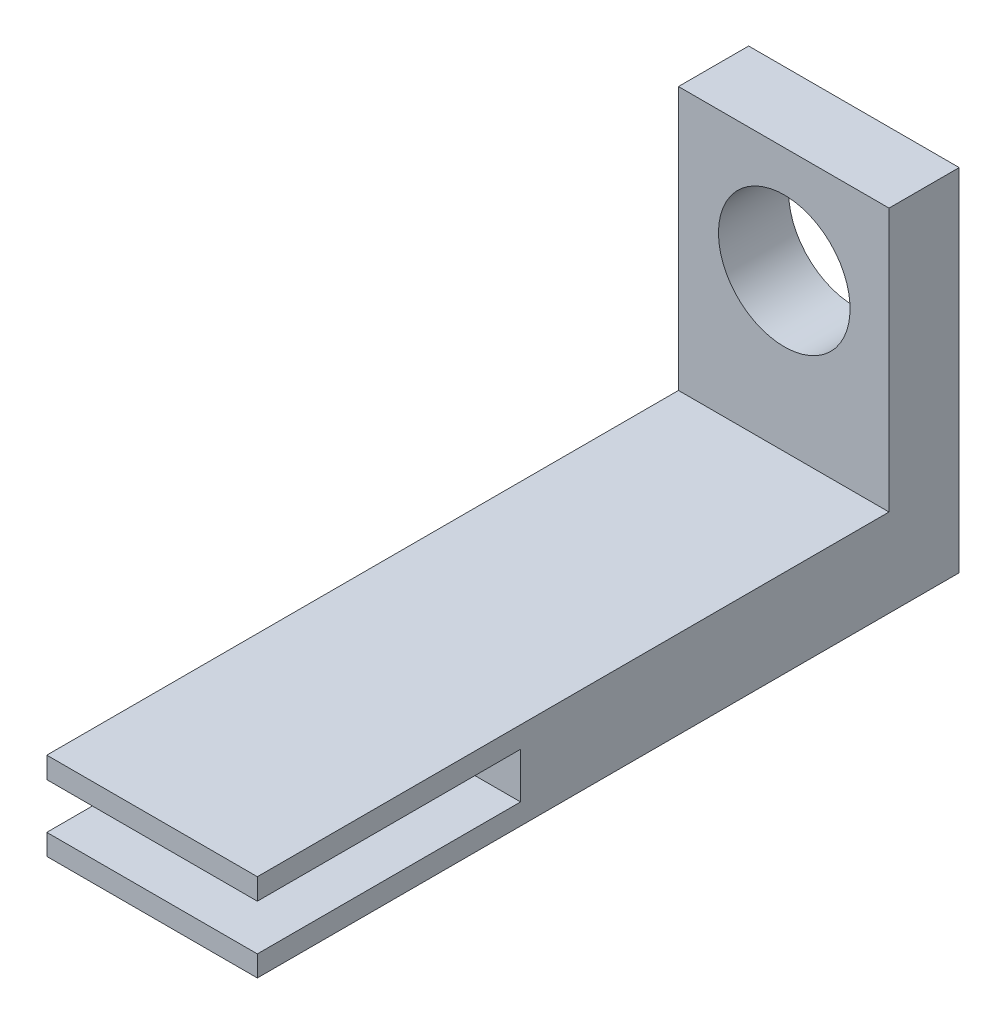
ISO-10303-21;
HEADER;
FILE_DESCRIPTION(('STEP AP214'),'2;1');
FILE_NAME('part.step','',(''),(''),'','','');
FILE_SCHEMA(('AUTOMOTIVE_DESIGN { 1 0 10303 214 1 1 1 1 }'));
ENDSEC;
DATA;
#1=APPLICATION_CONTEXT('core data for automotive mechanical design processes');
#2=APPLICATION_PROTOCOL_DEFINITION('international standard','automotive_design',2000,#1);
#3=PRODUCT_CONTEXT('',#1,'mechanical');
#4=PRODUCT('Part','Part','',(#3));
#5=PRODUCT_RELATED_PRODUCT_CATEGORY('part','',(#4));
#6=PRODUCT_DEFINITION_FORMATION('','',#4);
#7=PRODUCT_DEFINITION_CONTEXT('part definition',#1,'design');
#8=PRODUCT_DEFINITION('design','',#6,#7);
#9=PRODUCT_DEFINITION_SHAPE('','',#8);
#10=(LENGTH_UNIT() NAMED_UNIT(*) SI_UNIT(.MILLI.,.METRE.));
#11=(NAMED_UNIT(*) PLANE_ANGLE_UNIT() SI_UNIT($,.RADIAN.));
#12=(NAMED_UNIT(*) SI_UNIT($,.STERADIAN.) SOLID_ANGLE_UNIT());
#13=UNCERTAINTY_MEASURE_WITH_UNIT(LENGTH_MEASURE(1.E-05),#10,'distance_accuracy_value','');
#14=(GEOMETRIC_REPRESENTATION_CONTEXT(3) GLOBAL_UNCERTAINTY_ASSIGNED_CONTEXT((#13)) GLOBAL_UNIT_ASSIGNED_CONTEXT((#10,
#11,#12)) REPRESENTATION_CONTEXT('',''));
#15=CARTESIAN_POINT('',(0.,0.,0.));
#16=DIRECTION('',(0.,0.,1.));
#17=DIRECTION('',(1.,0.,0.));
#18=AXIS2_PLACEMENT_3D('',#15,#16,#17);
#19=CARTESIAN_POINT('',(-15.7647058823529,5.,-3.05882352941177));
#20=DIRECTION('',(0.,0.,-1.));
#21=DIRECTION('',(-1.,0.,0.));
#22=AXIS2_PLACEMENT_3D('',#19,#20,#21);
#23=PLANE('',#22);
#24=DIRECTION('',(0.,-1.,0.));
#25=VECTOR('',#24,1.);
#26=CARTESIAN_POINT('',(-3.76470588235294,5.,-3.05882352941177));
#27=LINE('',#26,#25);
#28=CARTESIAN_POINT('',(-3.76470588235294,1.18956511839395,-3.05882352941177));
#29=VERTEX_POINT('',#28);
#30=CARTESIAN_POINT('',(-3.76470588235294,0.,-3.05882352941177));
#31=VERTEX_POINT('',#30);
#32=EDGE_CURVE('E171',#29,#31,#27,.T.);
#33=ORIENTED_EDGE('',*,*,#32,.F.);
#34=DIRECTION('',(-1.,0.,0.));
#35=VECTOR('',#34,1.);
#36=CARTESIAN_POINT('',(-15.7647058823529,1.18956511839395,-3.05882352941177));
#37=LINE('',#36,#35);
#38=CARTESIAN_POINT('',(-15.7647058823529,1.18956511839395,-3.05882352941177));
#39=VERTEX_POINT('',#38);
#40=EDGE_CURVE('E46',#29,#39,#37,.T.);
#41=ORIENTED_EDGE('',*,*,#40,.T.);
#42=DIRECTION('',(0.,-1.,0.));
#43=VECTOR('',#42,1.);
#44=CARTESIAN_POINT('',(-15.7647058823529,5.,-3.05882352941177));
#45=LINE('',#44,#43);
#46=CARTESIAN_POINT('',(-15.7647058823529,0.,-3.05882352941177));
#47=VERTEX_POINT('',#46);
#48=EDGE_CURVE('E184',#39,#47,#45,.T.);
#49=ORIENTED_EDGE('',*,*,#48,.T.);
#50=DIRECTION('',(1.,0.,0.));
#51=VECTOR('',#50,1.);
#52=CARTESIAN_POINT('',(-15.7647058823529,0.,-3.05882352941177));
#53=LINE('',#52,#51);
#54=EDGE_CURVE('E167',#47,#31,#53,.T.);
#55=ORIENTED_EDGE('',*,*,#54,.T.);
#56=EDGE_LOOP('',(#33,#41,#49,#55));
#57=FACE_BOUND('',#56,.T.);
#58=ADVANCED_FACE('F37',(#57),#23,.F.);
#59=CARTESIAN_POINT('',(-3.76470588235294,5.,-43.0588235294118));
#60=DIRECTION('',(-1.,0.,0.));
#61=DIRECTION('',(0.,0.,1.));
#62=AXIS2_PLACEMENT_3D('',#59,#60,#61);
#63=PLANE('',#62);
#64=DIRECTION('',(0.,1.,0.));
#65=VECTOR('',#64,1.);
#66=CARTESIAN_POINT('',(-3.76470588235294,1.18956511839395,-18.0588235294118));
#67=LINE('',#66,#65);
#68=CARTESIAN_POINT('',(-3.76470588235294,1.18956511839395,-18.0588235294118));
#69=VERTEX_POINT('',#68);
#70=CARTESIAN_POINT('',(-3.76470588235294,3.78956511839395,-18.0588235294118));
#71=VERTEX_POINT('',#70);
#72=EDGE_CURVE('E142',#69,#71,#67,.T.);
#73=ORIENTED_EDGE('',*,*,#72,.F.);
#74=DIRECTION('',(0.,0.,1.));
#75=VECTOR('',#74,1.);
#76=CARTESIAN_POINT('',(-3.76470588235294,1.18956511839395,-18.0588235294118));
#77=LINE('',#76,#75);
#78=EDGE_CURVE('E154',#69,#29,#77,.T.);
#79=ORIENTED_EDGE('',*,*,#78,.T.);
#80=ORIENTED_EDGE('',*,*,#32,.T.);
#81=DIRECTION('',(0.,0.,-1.));
#82=VECTOR('',#81,1.);
#83=CARTESIAN_POINT('',(-3.76470588235294,0.,-43.0588235294118));
#84=LINE('',#83,#82);
#85=CARTESIAN_POINT('',(-3.76470588235294,0.,-43.0588235294118));
#86=VERTEX_POINT('',#85);
#87=EDGE_CURVE('E164',#31,#86,#84,.T.);
#88=ORIENTED_EDGE('',*,*,#87,.T.);
#89=DIRECTION('',(0.,-1.,0.));
#90=VECTOR('',#89,1.);
#91=CARTESIAN_POINT('',(-3.76470588235294,5.,-43.0588235294118));
#92=LINE('',#91,#90);
#93=CARTESIAN_POINT('',(-3.76470588235294,20.,-43.0588235294118));
#94=VERTEX_POINT('',#93);
#95=EDGE_CURVE('E190',#94,#86,#92,.T.);
#96=ORIENTED_EDGE('',*,*,#95,.F.);
#97=DIRECTION('',(0.,0.,-1.));
#98=VECTOR('',#97,1.);
#99=CARTESIAN_POINT('',(-3.76470588235294,20.,-43.0588235294118));
#100=LINE('',#99,#98);
#101=CARTESIAN_POINT('',(-3.76470588235294,20.,-39.0588235294118));
#102=VERTEX_POINT('',#101);
#103=EDGE_CURVE('E125',#102,#94,#100,.T.);
#104=ORIENTED_EDGE('',*,*,#103,.F.);
#105=DIRECTION('',(0.,-1.,0.));
#106=VECTOR('',#105,1.);
#107=CARTESIAN_POINT('',(-3.76470588235294,20.,-39.0588235294118));
#108=LINE('',#107,#106);
#109=CARTESIAN_POINT('',(-3.76470588235294,5.,-39.0588235294118));
#110=VERTEX_POINT('',#109);
#111=EDGE_CURVE('E121',#102,#110,#108,.T.);
#112=ORIENTED_EDGE('',*,*,#111,.T.);
#113=DIRECTION('',(0.,0.,-1.));
#114=VECTOR('',#113,1.);
#115=CARTESIAN_POINT('',(-3.76470588235294,5.,-43.0588235294118));
#116=LINE('',#115,#114);
#117=CARTESIAN_POINT('',(-3.76470588235294,5.,-3.05882352941177));
#118=VERTEX_POINT('',#117);
#119=EDGE_CURVE('E165',#118,#110,#116,.T.);
#120=ORIENTED_EDGE('',*,*,#119,.F.);
#121=CARTESIAN_POINT('',(-3.76470588235294,3.78956511839395,-3.05882352941177));
#122=VERTEX_POINT('',#121);
#123=EDGE_CURVE('E181',#118,#122,#27,.T.);
#124=ORIENTED_EDGE('',*,*,#123,.T.);
#125=DIRECTION('',(0.,0.,1.));
#126=VECTOR('',#125,1.);
#127=CARTESIAN_POINT('',(-3.76470588235294,3.78956511839395,-18.0588235294118));
#128=LINE('',#127,#126);
#129=EDGE_CURVE('E61',#71,#122,#128,.T.);
#130=ORIENTED_EDGE('',*,*,#129,.F.);
#131=EDGE_LOOP('',(#73,#79,#80,#88,#96,#104,#112,#120,#124,#130));
#132=FACE_BOUND('',#131,.T.);
#133=ADVANCED_FACE('F39',(#132),#63,.F.);
#134=CARTESIAN_POINT('',(-15.764705882353,5.,-43.0588235294118));
#135=DIRECTION('',(0.,0.,1.));
#136=DIRECTION('',(1.,0.,0.));
#137=AXIS2_PLACEMENT_3D('',#134,#135,#136);
#138=PLANE('',#137);
#139=CARTESIAN_POINT('',(-9.73479819459766,13.9179070959425,-43.0588235294118));
#140=DIRECTION('',(0.,0.,-1.));
#141=DIRECTION('',(-1.,0.,0.));
#142=AXIS2_PLACEMENT_3D('',#139,#140,#141);
#143=CIRCLE('',#142,3.75);
#144=CARTESIAN_POINT('',(-13.4847981945977,13.9179070959425,-43.0588235294118));
#145=VERTEX_POINT('',#144);
#146=EDGE_CURVE('E218',#145,#145,#143,.T.);
#147=ORIENTED_EDGE('',*,*,#146,.F.);
#148=EDGE_LOOP('',(#147));
#149=FACE_BOUND('',#148,.T.);
#150=DIRECTION('',(-1.,0.,0.));
#151=VECTOR('',#150,1.);
#152=CARTESIAN_POINT('',(-15.764705882353,0.,-43.0588235294118));
#153=LINE('',#152,#151);
#154=CARTESIAN_POINT('',(-15.764705882353,0.,-43.0588235294118));
#155=VERTEX_POINT('',#154);
#156=EDGE_CURVE('E174',#86,#155,#153,.T.);
#157=ORIENTED_EDGE('',*,*,#156,.T.);
#158=DIRECTION('',(0.,-1.,0.));
#159=VECTOR('',#158,1.);
#160=CARTESIAN_POINT('',(-15.764705882353,5.,-43.0588235294118));
#161=LINE('',#160,#159);
#162=CARTESIAN_POINT('',(-15.764705882353,20.,-43.0588235294118));
#163=VERTEX_POINT('',#162);
#164=EDGE_CURVE('E188',#163,#155,#161,.T.);
#165=ORIENTED_EDGE('',*,*,#164,.F.);
#166=DIRECTION('',(-1.,0.,0.));
#167=VECTOR('',#166,1.);
#168=CARTESIAN_POINT('',(-15.764705882353,20.,-43.0588235294118));
#169=LINE('',#168,#167);
#170=EDGE_CURVE('E132',#94,#163,#169,.T.);
#171=ORIENTED_EDGE('',*,*,#170,.F.);
#172=ORIENTED_EDGE('',*,*,#95,.T.);
#173=EDGE_LOOP('',(#157,#165,#171,#172));
#174=FACE_BOUND('',#173,.T.);
#175=ADVANCED_FACE('F238',(#149,#174),#138,.F.);
#176=CARTESIAN_POINT('',(-15.764705882353,5.,-43.0588235294118));
#177=DIRECTION('',(1.,0.,0.));
#178=DIRECTION('',(0.,0.,-1.));
#179=AXIS2_PLACEMENT_3D('',#176,#177,#178);
#180=PLANE('',#179);
#181=ORIENTED_EDGE('',*,*,#48,.F.);
#182=DIRECTION('',(0.,0.,-1.));
#183=VECTOR('',#182,1.);
#184=CARTESIAN_POINT('',(-15.764705882353,1.18956511839395,-43.0588235294118));
#185=LINE('',#184,#183);
#186=CARTESIAN_POINT('',(-15.7647058823529,1.18956511839395,-18.0588235294118));
#187=VERTEX_POINT('',#186);
#188=EDGE_CURVE('E161',#39,#187,#185,.T.);
#189=ORIENTED_EDGE('',*,*,#188,.T.);
#190=DIRECTION('',(0.,1.,0.));
#191=VECTOR('',#190,1.);
#192=CARTESIAN_POINT('',(-15.7647058823529,5.,-18.0588235294118));
#193=LINE('',#192,#191);
#194=CARTESIAN_POINT('',(-15.7647058823529,3.78956511839395,-18.0588235294118));
#195=VERTEX_POINT('',#194);
#196=EDGE_CURVE('E11',#187,#195,#193,.T.);
#197=ORIENTED_EDGE('',*,*,#196,.T.);
#198=DIRECTION('',(0.,0.,1.));
#199=VECTOR('',#198,1.);
#200=CARTESIAN_POINT('',(-15.764705882353,3.78956511839395,-43.0588235294118));
#201=LINE('',#200,#199);
#202=CARTESIAN_POINT('',(-15.7647058823529,3.78956511839395,-3.05882352941177));
#203=VERTEX_POINT('',#202);
#204=EDGE_CURVE('E157',#195,#203,#201,.T.);
#205=ORIENTED_EDGE('',*,*,#204,.T.);
#206=CARTESIAN_POINT('',(-15.7647058823529,5.,-3.05882352941177));
#207=VERTEX_POINT('',#206);
#208=EDGE_CURVE('E185',#207,#203,#45,.T.);
#209=ORIENTED_EDGE('',*,*,#208,.F.);
#210=DIRECTION('',(0.,0.,1.));
#211=VECTOR('',#210,1.);
#212=CARTESIAN_POINT('',(-15.764705882353,5.,-43.0588235294118));
#213=LINE('',#212,#211);
#214=CARTESIAN_POINT('',(-15.764705882353,5.,-39.0588235294118));
#215=VERTEX_POINT('',#214);
#216=EDGE_CURVE('E139',#215,#207,#213,.T.);
#217=ORIENTED_EDGE('',*,*,#216,.F.);
#218=DIRECTION('',(0.,-1.,0.));
#219=VECTOR('',#218,1.);
#220=CARTESIAN_POINT('',(-15.764705882353,20.,-39.0588235294118));
#221=LINE('',#220,#219);
#222=CARTESIAN_POINT('',(-15.764705882353,20.,-39.0588235294118));
#223=VERTEX_POINT('',#222);
#224=EDGE_CURVE('E119',#223,#215,#221,.T.);
#225=ORIENTED_EDGE('',*,*,#224,.F.);
#226=DIRECTION('',(0.,0.,1.));
#227=VECTOR('',#226,1.);
#228=CARTESIAN_POINT('',(-15.764705882353,20.,-43.0588235294118));
#229=LINE('',#228,#227);
#230=EDGE_CURVE('E126',#163,#223,#229,.T.);
#231=ORIENTED_EDGE('',*,*,#230,.F.);
#232=ORIENTED_EDGE('',*,*,#164,.T.);
#233=DIRECTION('',(0.,0.,1.));
#234=VECTOR('',#233,1.);
#235=CARTESIAN_POINT('',(-15.764705882353,0.,-43.0588235294118));
#236=LINE('',#235,#234);
#237=EDGE_CURVE('E176',#155,#47,#236,.T.);
#238=ORIENTED_EDGE('',*,*,#237,.T.);
#239=EDGE_LOOP('',(#181,#189,#197,#205,#209,#217,#225,#231,#232,#238));
#240=FACE_BOUND('',#239,.T.);
#241=ADVANCED_FACE('F137',(#240),#180,.F.);
#242=ORIENTED_EDGE('',*,*,#208,.T.);
#243=DIRECTION('',(-1.,0.,0.));
#244=VECTOR('',#243,1.);
#245=CARTESIAN_POINT('',(-15.7688101432617,3.78956511839395,-3.05882352941177));
#246=LINE('',#245,#244);
#247=EDGE_CURVE('E140',#122,#203,#246,.T.);
#248=ORIENTED_EDGE('',*,*,#247,.F.);
#249=ORIENTED_EDGE('',*,*,#123,.F.);
#250=DIRECTION('',(1.,0.,0.));
#251=VECTOR('',#250,1.);
#252=CARTESIAN_POINT('',(-15.7647058823529,5.,-3.05882352941177));
#253=LINE('',#252,#251);
#254=EDGE_CURVE('E169',#207,#118,#253,.T.);
#255=ORIENTED_EDGE('',*,*,#254,.F.);
#256=EDGE_LOOP('',(#242,#248,#249,#255));
#257=FACE_BOUND('',#256,.T.);
#258=ADVANCED_FACE('F211',(#257),#23,.F.);
#259=CARTESIAN_POINT('',(0.,5.,0.));
#260=DIRECTION('',(0.,1.,0.));
#261=DIRECTION('',(0.,0.,1.));
#262=AXIS2_PLACEMENT_3D('',#259,#260,#261);
#263=PLANE('',#262);
#264=DIRECTION('',(1.,0.,0.));
#265=VECTOR('',#264,1.);
#266=CARTESIAN_POINT('',(-15.764705882353,5.,-39.0588235294118));
#267=LINE('',#266,#265);
#268=EDGE_CURVE('E53',#215,#110,#267,.T.);
#269=ORIENTED_EDGE('',*,*,#268,.F.);
#270=ORIENTED_EDGE('',*,*,#216,.T.);
#271=ORIENTED_EDGE('',*,*,#254,.T.);
#272=ORIENTED_EDGE('',*,*,#119,.T.);
#273=EDGE_LOOP('',(#269,#270,#271,#272));
#274=FACE_BOUND('',#273,.T.);
#275=ADVANCED_FACE('F214',(#274),#263,.T.);
#276=CARTESIAN_POINT('',(0.,0.,0.));
#277=DIRECTION('',(0.,1.,0.));
#278=DIRECTION('',(0.,0.,1.));
#279=AXIS2_PLACEMENT_3D('',#276,#277,#278);
#280=PLANE('',#279);
#281=ORIENTED_EDGE('',*,*,#87,.F.);
#282=ORIENTED_EDGE('',*,*,#54,.F.);
#283=ORIENTED_EDGE('',*,*,#237,.F.);
#284=ORIENTED_EDGE('',*,*,#156,.F.);
#285=EDGE_LOOP('',(#281,#282,#283,#284));
#286=FACE_BOUND('',#285,.T.);
#287=ADVANCED_FACE('F202',(#286),#280,.F.);
#288=CARTESIAN_POINT('',(0.,0.,-18.0588235294118));
#289=DIRECTION('',(0.,0.,-1.));
#290=DIRECTION('',(-1.,0.,0.));
#291=AXIS2_PLACEMENT_3D('',#288,#289,#290);
#292=PLANE('',#291);
#293=DIRECTION('',(1.,0.,0.));
#294=VECTOR('',#293,1.);
#295=CARTESIAN_POINT('',(-15.7688101432617,1.18956511839395,-18.0588235294118));
#296=LINE('',#295,#294);
#297=EDGE_CURVE('E152',#187,#69,#296,.T.);
#298=ORIENTED_EDGE('',*,*,#297,.T.);
#299=ORIENTED_EDGE('',*,*,#72,.T.);
#300=DIRECTION('',(-1.,0.,0.));
#301=VECTOR('',#300,1.);
#302=CARTESIAN_POINT('',(-15.7688101432617,3.78956511839395,-18.0588235294118));
#303=LINE('',#302,#301);
#304=EDGE_CURVE('E149',#71,#195,#303,.T.);
#305=ORIENTED_EDGE('',*,*,#304,.T.);
#306=ORIENTED_EDGE('',*,*,#196,.F.);
#307=EDGE_LOOP('',(#298,#299,#305,#306));
#308=FACE_BOUND('',#307,.T.);
#309=ADVANCED_FACE('F208',(#308),#292,.F.);
#310=CARTESIAN_POINT('',(-15.7688101432617,1.18956511839395,-18.0588235294118));
#311=DIRECTION('',(0.,-1.,0.));
#312=DIRECTION('',(0.,0.,-1.));
#313=AXIS2_PLACEMENT_3D('',#310,#311,#312);
#314=PLANE('',#313);
#315=ORIENTED_EDGE('',*,*,#40,.F.);
#316=ORIENTED_EDGE('',*,*,#78,.F.);
#317=ORIENTED_EDGE('',*,*,#297,.F.);
#318=ORIENTED_EDGE('',*,*,#188,.F.);
#319=EDGE_LOOP('',(#315,#316,#317,#318));
#320=FACE_BOUND('',#319,.T.);
#321=ADVANCED_FACE('F206',(#320),#314,.F.);
#322=CARTESIAN_POINT('',(-15.7688101432617,3.78956511839395,-18.0588235294118));
#323=DIRECTION('',(0.,1.,0.));
#324=DIRECTION('',(0.,0.,1.));
#325=AXIS2_PLACEMENT_3D('',#322,#323,#324);
#326=PLANE('',#325);
#327=ORIENTED_EDGE('',*,*,#304,.F.);
#328=ORIENTED_EDGE('',*,*,#129,.T.);
#329=ORIENTED_EDGE('',*,*,#247,.T.);
#330=ORIENTED_EDGE('',*,*,#204,.F.);
#331=EDGE_LOOP('',(#327,#328,#329,#330));
#332=FACE_BOUND('',#331,.T.);
#333=ADVANCED_FACE('F267',(#332),#326,.F.);
#334=CARTESIAN_POINT('',(-15.764705882353,20.,-39.0588235294118));
#335=DIRECTION('',(0.,0.,-1.));
#336=DIRECTION('',(-1.,0.,0.));
#337=AXIS2_PLACEMENT_3D('',#334,#335,#336);
#338=PLANE('',#337);
#339=CARTESIAN_POINT('',(-9.73479819459766,13.9179070959425,-39.0588235294118));
#340=DIRECTION('',(0.,0.,-1.));
#341=DIRECTION('',(-1.,0.,0.));
#342=AXIS2_PLACEMENT_3D('',#339,#340,#341);
#343=CIRCLE('',#342,3.75);
#344=CARTESIAN_POINT('',(-13.4847981945977,13.9179070959425,-39.0588235294118));
#345=VERTEX_POINT('',#344);
#346=EDGE_CURVE('E41',#345,#345,#343,.T.);
#347=ORIENTED_EDGE('',*,*,#346,.T.);
#348=EDGE_LOOP('',(#347));
#349=FACE_BOUND('',#348,.T.);
#350=ORIENTED_EDGE('',*,*,#268,.T.);
#351=ORIENTED_EDGE('',*,*,#111,.F.);
#352=DIRECTION('',(1.,0.,0.));
#353=VECTOR('',#352,1.);
#354=CARTESIAN_POINT('',(-15.764705882353,20.,-39.0588235294118));
#355=LINE('',#354,#353);
#356=EDGE_CURVE('E115',#223,#102,#355,.T.);
#357=ORIENTED_EDGE('',*,*,#356,.F.);
#358=ORIENTED_EDGE('',*,*,#224,.T.);
#359=EDGE_LOOP('',(#350,#351,#357,#358));
#360=FACE_BOUND('',#359,.T.);
#361=ADVANCED_FACE('F117',(#349,#360),#338,.F.);
#362=CARTESIAN_POINT('',(0.,20.,0.));
#363=DIRECTION('',(0.,1.,0.));
#364=DIRECTION('',(0.,0.,1.));
#365=AXIS2_PLACEMENT_3D('',#362,#363,#364);
#366=PLANE('',#365);
#367=ORIENTED_EDGE('',*,*,#230,.T.);
#368=ORIENTED_EDGE('',*,*,#356,.T.);
#369=ORIENTED_EDGE('',*,*,#103,.T.);
#370=ORIENTED_EDGE('',*,*,#170,.T.);
#371=EDGE_LOOP('',(#367,#368,#369,#370));
#372=FACE_BOUND('',#371,.T.);
#373=ADVANCED_FACE('F130',(#372),#366,.T.);
#374=CARTESIAN_POINT('',(-9.73479819459766,13.9179070959425,-28.0588235294118));
#375=DIRECTION('',(0.,0.,-1.));
#376=DIRECTION('',(-1.,0.,0.));
#377=AXIS2_PLACEMENT_3D('',#374,#375,#376);
#378=CYLINDRICAL_SURFACE('',#377,3.75);
#379=ORIENTED_EDGE('',*,*,#146,.T.);
#380=EDGE_LOOP('',(#379));
#381=FACE_BOUND('',#380,.T.);
#382=ORIENTED_EDGE('',*,*,#346,.F.);
#383=EDGE_LOOP('',(#382));
#384=FACE_BOUND('',#383,.T.);
#385=ADVANCED_FACE('F226',(#381,#384),#378,.F.);
#386=CLOSED_SHELL('',(#58,#133,#175,#241,#258,#275,#287,#309,#321,#333,#361,#373,#385));
#387=MANIFOLD_SOLID_BREP('B2',#386);
#388=ADVANCED_BREP_SHAPE_REPRESENTATION('',(#18,#387),#14);
#389=SHAPE_DEFINITION_REPRESENTATION(#9,#388);
ENDSEC;
END-ISO-10303-21;
